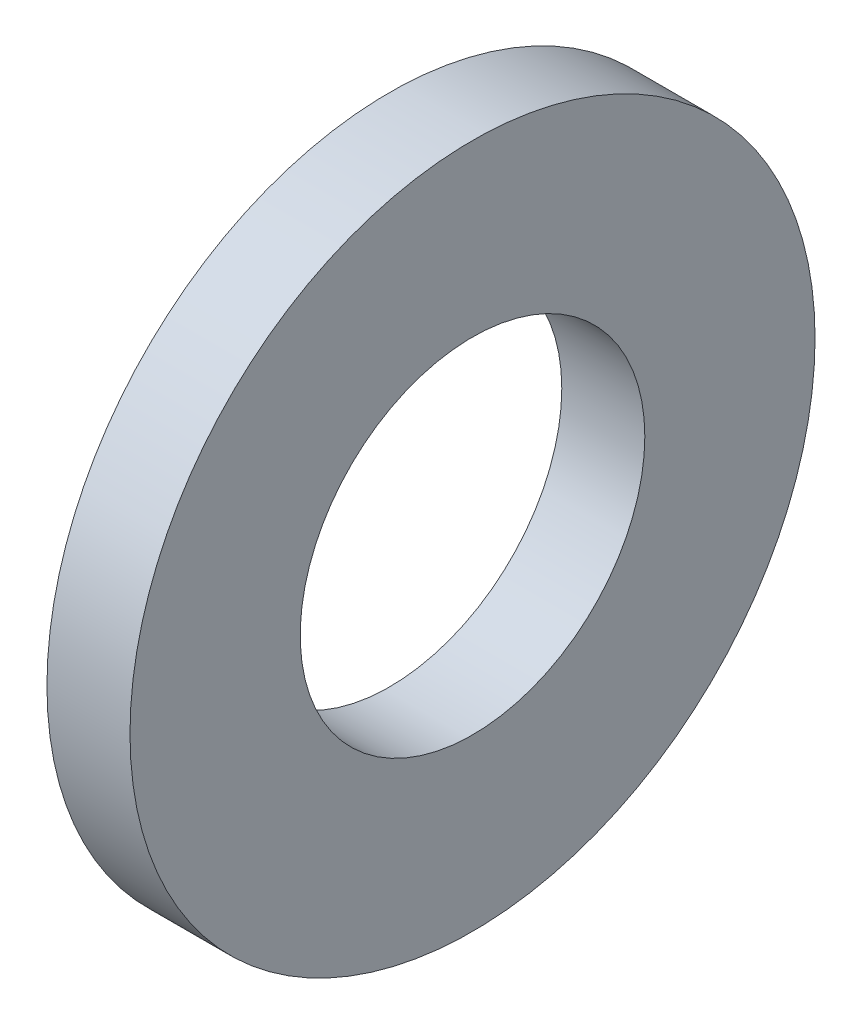
ISO-10303-21;
HEADER;
FILE_DESCRIPTION(('STEP AP214'),'2;1');
FILE_NAME('part.step','',(''),(''),'','','');
FILE_SCHEMA(('AUTOMOTIVE_DESIGN { 1 0 10303 214 1 1 1 1 }'));
ENDSEC;
DATA;
#1=APPLICATION_CONTEXT('core data for automotive mechanical design processes');
#2=APPLICATION_PROTOCOL_DEFINITION('international standard','automotive_design',2000,#1);
#3=PRODUCT_CONTEXT('',#1,'mechanical');
#4=PRODUCT('Part','Part','',(#3));
#5=PRODUCT_RELATED_PRODUCT_CATEGORY('part','',(#4));
#6=PRODUCT_DEFINITION_FORMATION('','',#4);
#7=PRODUCT_DEFINITION_CONTEXT('part definition',#1,'design');
#8=PRODUCT_DEFINITION('design','',#6,#7);
#9=PRODUCT_DEFINITION_SHAPE('','',#8);
#10=(LENGTH_UNIT() NAMED_UNIT(*) SI_UNIT(.MILLI.,.METRE.));
#11=(NAMED_UNIT(*) PLANE_ANGLE_UNIT() SI_UNIT($,.RADIAN.));
#12=(NAMED_UNIT(*) SI_UNIT($,.STERADIAN.) SOLID_ANGLE_UNIT());
#13=UNCERTAINTY_MEASURE_WITH_UNIT(LENGTH_MEASURE(1.E-05),#10,'distance_accuracy_value','');
#14=(GEOMETRIC_REPRESENTATION_CONTEXT(3) GLOBAL_UNCERTAINTY_ASSIGNED_CONTEXT((#13)) GLOBAL_UNIT_ASSIGNED_CONTEXT((#10,
#11,#12)) REPRESENTATION_CONTEXT('',''));
#15=CARTESIAN_POINT('',(0.,0.,0.));
#16=DIRECTION('',(0.,0.,1.));
#17=DIRECTION('',(1.,0.,0.));
#18=AXIS2_PLACEMENT_3D('',#15,#16,#17);
#19=CARTESIAN_POINT('',(2.,0.,0.));
#20=DIRECTION('',(1.,0.,0.));
#21=DIRECTION('',(0.,0.,-1.));
#22=AXIS2_PLACEMENT_3D('',#19,#20,#21);
#23=PLANE('',#22);
#24=CARTESIAN_POINT('',(2.,0.,0.));
#25=DIRECTION('',(1.,0.,0.));
#26=DIRECTION('',(0.,0.,-1.));
#27=AXIS2_PLACEMENT_3D('',#24,#25,#26);
#28=CIRCLE('',#27,8.25);
#29=CARTESIAN_POINT('',(2.,0.,-8.25));
#30=VERTEX_POINT('',#29);
#31=EDGE_CURVE('E10',#30,#30,#28,.T.);
#32=ORIENTED_EDGE('',*,*,#31,.T.);
#33=EDGE_LOOP('',(#32));
#34=FACE_BOUND('',#33,.T.);
#35=CARTESIAN_POINT('',(2.,0.,0.));
#36=DIRECTION('',(1.,0.,0.));
#37=DIRECTION('',(0.,0.,-1.));
#38=AXIS2_PLACEMENT_3D('',#35,#36,#37);
#39=CIRCLE('',#38,4.15);
#40=CARTESIAN_POINT('',(2.,0.,-4.15));
#41=VERTEX_POINT('',#40);
#42=EDGE_CURVE('E52',#41,#41,#39,.T.);
#43=ORIENTED_EDGE('',*,*,#42,.F.);
#44=EDGE_LOOP('',(#43));
#45=FACE_BOUND('',#44,.T.);
#46=ADVANCED_FACE('F41',(#34,#45),#23,.T.);
#47=CARTESIAN_POINT('',(0.,0.,0.));
#48=DIRECTION('',(1.,0.,0.));
#49=DIRECTION('',(0.,0.,-1.));
#50=AXIS2_PLACEMENT_3D('',#47,#48,#49);
#51=PLANE('',#50);
#52=CARTESIAN_POINT('',(0.,0.,0.));
#53=DIRECTION('',(1.,0.,0.));
#54=DIRECTION('',(0.,0.,-1.));
#55=AXIS2_PLACEMENT_3D('',#52,#53,#54);
#56=CIRCLE('',#55,8.25);
#57=CARTESIAN_POINT('',(0.,0.,-8.25));
#58=VERTEX_POINT('',#57);
#59=EDGE_CURVE('E45',#58,#58,#56,.T.);
#60=ORIENTED_EDGE('',*,*,#59,.F.);
#61=EDGE_LOOP('',(#60));
#62=FACE_BOUND('',#61,.T.);
#63=CARTESIAN_POINT('',(0.,0.,0.));
#64=DIRECTION('',(1.,0.,0.));
#65=DIRECTION('',(0.,0.,-1.));
#66=AXIS2_PLACEMENT_3D('',#63,#64,#65);
#67=CIRCLE('',#66,4.15);
#68=CARTESIAN_POINT('',(0.,0.,-4.15));
#69=VERTEX_POINT('',#68);
#70=EDGE_CURVE('E54',#69,#69,#67,.T.);
#71=ORIENTED_EDGE('',*,*,#70,.T.);
#72=EDGE_LOOP('',(#71));
#73=FACE_BOUND('',#72,.T.);
#74=ADVANCED_FACE('F64',(#62,#73),#51,.F.);
#75=CARTESIAN_POINT('',(2.,0.,0.));
#76=DIRECTION('',(-1.,0.,0.));
#77=DIRECTION('',(0.,0.,1.));
#78=AXIS2_PLACEMENT_3D('',#75,#76,#77);
#79=CYLINDRICAL_SURFACE('',#78,8.25);
#80=ORIENTED_EDGE('',*,*,#31,.F.);
#81=EDGE_LOOP('',(#80));
#82=FACE_BOUND('',#81,.T.);
#83=ORIENTED_EDGE('',*,*,#59,.T.);
#84=EDGE_LOOP('',(#83));
#85=FACE_BOUND('',#84,.T.);
#86=ADVANCED_FACE('F43',(#82,#85),#79,.T.);
#87=CARTESIAN_POINT('',(2.,0.,0.));
#88=DIRECTION('',(-1.,0.,0.));
#89=DIRECTION('',(0.,0.,1.));
#90=AXIS2_PLACEMENT_3D('',#87,#88,#89);
#91=CYLINDRICAL_SURFACE('',#90,4.15);
#92=ORIENTED_EDGE('',*,*,#42,.T.);
#93=EDGE_LOOP('',(#92));
#94=FACE_BOUND('',#93,.T.);
#95=ORIENTED_EDGE('',*,*,#70,.F.);
#96=EDGE_LOOP('',(#95));
#97=FACE_BOUND('',#96,.T.);
#98=ADVANCED_FACE('F60',(#94,#97),#91,.F.);
#99=CLOSED_SHELL('',(#46,#74,#86,#98));
#100=MANIFOLD_SOLID_BREP('B2',#99);
#101=ADVANCED_BREP_SHAPE_REPRESENTATION('',(#18,#100),#14);
#102=SHAPE_DEFINITION_REPRESENTATION(#9,#101);
ENDSEC;
END-ISO-10303-21;
